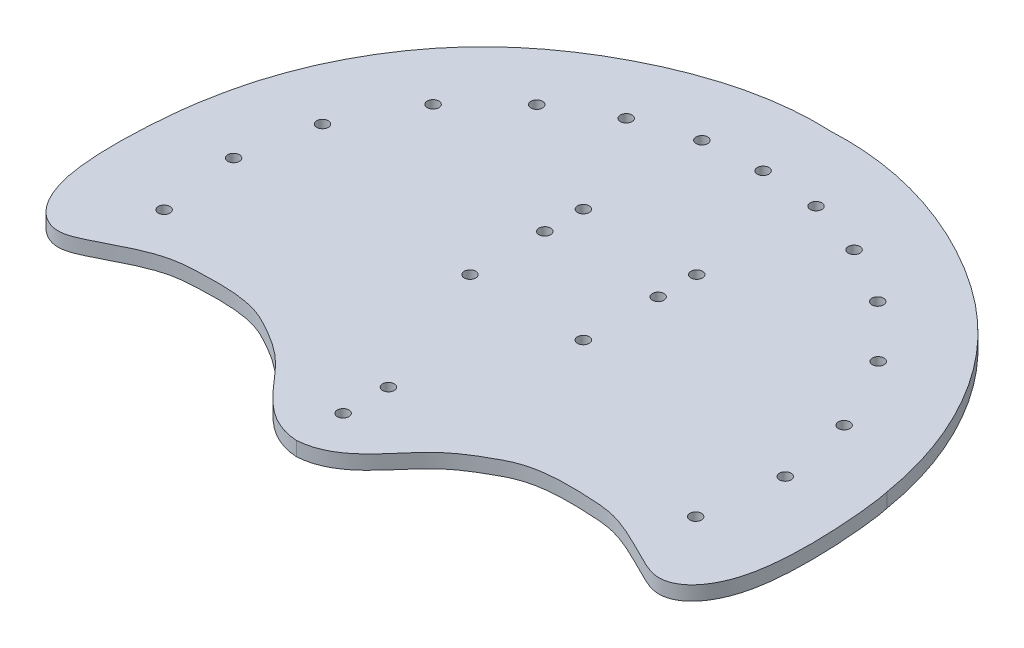
ISO-10303-21;
HEADER;
FILE_DESCRIPTION(('STEP AP214'),'2;1');
FILE_NAME('part.step','',(''),(''),'','','');
FILE_SCHEMA(('AUTOMOTIVE_DESIGN { 1 0 10303 214 1 1 1 1 }'));
ENDSEC;
DATA;
#1=APPLICATION_CONTEXT('core data for automotive mechanical design processes');
#2=APPLICATION_PROTOCOL_DEFINITION('international standard','automotive_design',2000,#1);
#3=PRODUCT_CONTEXT('',#1,'mechanical');
#4=PRODUCT('Part','Part','',(#3));
#5=PRODUCT_RELATED_PRODUCT_CATEGORY('part','',(#4));
#6=PRODUCT_DEFINITION_FORMATION('','',#4);
#7=PRODUCT_DEFINITION_CONTEXT('part definition',#1,'design');
#8=PRODUCT_DEFINITION('design','',#6,#7);
#9=PRODUCT_DEFINITION_SHAPE('','',#8);
#10=(LENGTH_UNIT() NAMED_UNIT(*) SI_UNIT(.MILLI.,.METRE.));
#11=(NAMED_UNIT(*) PLANE_ANGLE_UNIT() SI_UNIT($,.RADIAN.));
#12=(NAMED_UNIT(*) SI_UNIT($,.STERADIAN.) SOLID_ANGLE_UNIT());
#13=UNCERTAINTY_MEASURE_WITH_UNIT(LENGTH_MEASURE(1.E-05),#10,'distance_accuracy_value','');
#14=(GEOMETRIC_REPRESENTATION_CONTEXT(3) GLOBAL_UNCERTAINTY_ASSIGNED_CONTEXT((#13)) GLOBAL_UNIT_ASSIGNED_CONTEXT((#10,
#11,#12)) REPRESENTATION_CONTEXT('',''));
#15=CARTESIAN_POINT('',(0.,0.,0.));
#16=DIRECTION('',(0.,0.,1.));
#17=DIRECTION('',(1.,0.,0.));
#18=AXIS2_PLACEMENT_3D('',#15,#16,#17);
#19=CARTESIAN_POINT('',(-190.5,7.9502,0.));
#20=CARTESIAN_POINT('',(-192.064011792662,7.9502,4.96350192621509));
#21=CARTESIAN_POINT('',(-201.967167765924,7.9502,83.3146183109833));
#22=CARTESIAN_POINT('',(-174.696602041029,7.9502,109.289958804391));
#23=CARTESIAN_POINT('',(-151.630121659032,7.9502,100.567984898405));
#24=CARTESIAN_POINT('',(-131.410771519055,7.9502,87.7197839609674));
#25=CARTESIAN_POINT('',(-96.8435676275136,7.9502,85.3754033772216));
#26=CARTESIAN_POINT('',(-78.6925101438482,7.9502,86.2588274201763));
#27=CARTESIAN_POINT('',(-58.8335330715194,7.9502,96.8793824699203));
#28=CARTESIAN_POINT('',(-37.3059346099107,7.9502,109.935798161985));
#29=CARTESIAN_POINT('',(-21.3496139460233,7.9502,139.114767456721));
#30=CARTESIAN_POINT('',(1.40754784340045E-13,7.9502,140.530090072389));
#31=B_SPLINE_CURVE_WITH_KNOTS('',3,(#19,#20,#21,#22,#23,#24,#25,#26,#27,#28,#29,#30),
.UNSPECIFIED.,.F.,.F.,(4,1,1,1,1,1,1,1,1,4),(0.,0.166997051795611,0.292320514089622,
0.319633117373991,0.426735310498713,0.458914050276757,0.609241775376387,0.641909703937047,
0.766802370245909,1.),.UNSPECIFIED.);
#32=DIRECTION('',(0.,-1.,0.));
#33=VECTOR('',#32,1.);
#34=SURFACE_OF_LINEAR_EXTRUSION('',#31,#33);
#35=CARTESIAN_POINT('',(-190.5,0.,0.));
#36=CARTESIAN_POINT('',(-192.064011792662,0.,4.96350192621509));
#37=CARTESIAN_POINT('',(-201.967167765924,0.,83.3146183109833));
#38=CARTESIAN_POINT('',(-174.696602041029,0.,109.289958804391));
#39=CARTESIAN_POINT('',(-151.630121659032,0.,100.567984898405));
#40=CARTESIAN_POINT('',(-131.410771519055,0.,87.7197839609674));
#41=CARTESIAN_POINT('',(-96.8435676275136,0.,85.3754033772216));
#42=CARTESIAN_POINT('',(-78.6925101438482,0.,86.2588274201763));
#43=CARTESIAN_POINT('',(-58.8335330715194,0.,96.8793824699203));
#44=CARTESIAN_POINT('',(-37.3059346099107,0.,109.935798161985));
#45=CARTESIAN_POINT('',(-21.3496139460233,0.,139.114767456721));
#46=CARTESIAN_POINT('',(1.40754784340045E-13,0.,140.530090072389));
#47=B_SPLINE_CURVE_WITH_KNOTS('',3,(#35,#36,#37,#38,#39,#40,#41,#42,#43,#44,#45,#46),
.UNSPECIFIED.,.F.,.F.,(4,1,1,1,1,1,1,1,1,4),(0.,0.166997051795611,0.292320514089622,
0.319633117373991,0.426735310498713,0.458914050276757,0.609241775376387,0.641909703937047,
0.766802370245909,1.),.UNSPECIFIED.);
#48=CARTESIAN_POINT('',(-190.5,0.,0.));
#49=VERTEX_POINT('',#48);
#50=CARTESIAN_POINT('',(-1.06334839341837E-13,0.,140.530090072389));
#51=VERTEX_POINT('',#50);
#52=EDGE_CURVE('E132',#49,#51,#47,.T.);
#53=ORIENTED_EDGE('',*,*,#52,.T.);
#54=DIRECTION('',(0.,-1.,0.));
#55=VECTOR('',#54,1.);
#56=CARTESIAN_POINT('',(-1.06334839341837E-13,7.9502,140.530090072389));
#57=LINE('',#56,#55);
#58=CARTESIAN_POINT('',(-1.06334839341837E-13,7.9502,140.530090072389));
#59=VERTEX_POINT('',#58);
#60=EDGE_CURVE('E11',#59,#51,#57,.T.);
#61=ORIENTED_EDGE('',*,*,#60,.F.);
#62=CARTESIAN_POINT('',(-190.5,7.9502,0.));
#63=VERTEX_POINT('',#62);
#64=EDGE_CURVE('E95',#63,#59,#31,.T.);
#65=ORIENTED_EDGE('',*,*,#64,.F.);
#66=DIRECTION('',(0.,-1.,0.));
#67=VECTOR('',#66,1.);
#68=CARTESIAN_POINT('',(-190.5,7.9502,0.));
#69=LINE('',#68,#67);
#70=EDGE_CURVE('E103',#63,#49,#69,.T.);
#71=ORIENTED_EDGE('',*,*,#70,.T.);
#72=EDGE_LOOP('',(#53,#61,#65,#71));
#73=FACE_BOUND('',#72,.T.);
#74=ADVANCED_FACE('F43',(#73),#34,.F.);
#75=CARTESIAN_POINT('',(-1.06334839341837E-13,7.9502,140.530090072389));
#76=CARTESIAN_POINT('',(21.3496139460233,7.9502,139.114767456721));
#77=CARTESIAN_POINT('',(37.3059346099107,7.9502,109.935798161984));
#78=CARTESIAN_POINT('',(58.8335330715195,7.9502,96.8793824699203));
#79=CARTESIAN_POINT('',(78.6925101438482,7.9502,86.2588274201763));
#80=CARTESIAN_POINT('',(96.8435676275136,7.9502,85.3754033772216));
#81=CARTESIAN_POINT('',(131.410771519055,7.9502,87.7197839609674));
#82=CARTESIAN_POINT('',(151.630121659032,7.9502,100.567984898405));
#83=CARTESIAN_POINT('',(174.696602041029,7.9502,109.289958804391));
#84=CARTESIAN_POINT('',(201.967167765924,7.9502,83.3146183109832));
#85=CARTESIAN_POINT('',(192.064011792662,7.9502,4.96350192621503));
#86=CARTESIAN_POINT('',(190.5,7.9502,0.));
#87=B_SPLINE_CURVE_WITH_KNOTS('',3,(#75,#76,#77,#78,#79,#80,#81,#82,#83,#84,#85,#86),
.UNSPECIFIED.,.F.,.F.,(4,1,1,1,1,1,1,1,1,4),(0.,0.233197629754091,0.358090296062953,
0.390758224623613,0.541085949723243,0.573264689501287,0.680366882626009,0.707679485910378,
0.833002948204389,1.),.UNSPECIFIED.);
#88=DIRECTION('',(0.,-1.,0.));
#89=VECTOR('',#88,1.);
#90=SURFACE_OF_LINEAR_EXTRUSION('',#87,#89);
#91=CARTESIAN_POINT('',(-1.06334839341837E-13,0.,140.530090072389));
#92=CARTESIAN_POINT('',(21.3496139460233,0.,139.114767456721));
#93=CARTESIAN_POINT('',(37.3059346099107,0.,109.935798161984));
#94=CARTESIAN_POINT('',(58.8335330715195,0.,96.8793824699203));
#95=CARTESIAN_POINT('',(78.6925101438482,0.,86.2588274201763));
#96=CARTESIAN_POINT('',(96.8435676275136,0.,85.3754033772216));
#97=CARTESIAN_POINT('',(131.410771519055,0.,87.7197839609674));
#98=CARTESIAN_POINT('',(151.630121659032,0.,100.567984898405));
#99=CARTESIAN_POINT('',(174.696602041029,0.,109.289958804391));
#100=CARTESIAN_POINT('',(201.967167765924,0.,83.3146183109832));
#101=CARTESIAN_POINT('',(192.064011792662,0.,4.96350192621503));
#102=CARTESIAN_POINT('',(190.5,0.,0.));
#103=B_SPLINE_CURVE_WITH_KNOTS('',3,(#91,#92,#93,#94,#95,#96,#97,#98,#99,#100,#101,#102),
.UNSPECIFIED.,.F.,.F.,(4,1,1,1,1,1,1,1,1,4),(0.,0.233197629754091,0.358090296062953,
0.390758224623613,0.541085949723243,0.573264689501287,0.680366882626009,0.707679485910378,
0.833002948204389,1.),.UNSPECIFIED.);
#104=CARTESIAN_POINT('',(190.5,0.,0.));
#105=VERTEX_POINT('',#104);
#106=EDGE_CURVE('E99',#51,#105,#103,.T.);
#107=ORIENTED_EDGE('',*,*,#106,.T.);
#108=DIRECTION('',(0.,-1.,0.));
#109=VECTOR('',#108,1.);
#110=CARTESIAN_POINT('',(190.5,7.9502,0.));
#111=LINE('',#110,#109);
#112=CARTESIAN_POINT('',(190.5,7.9502,0.));
#113=VERTEX_POINT('',#112);
#114=EDGE_CURVE('E52',#113,#105,#111,.T.);
#115=ORIENTED_EDGE('',*,*,#114,.F.);
#116=EDGE_CURVE('E90',#59,#113,#87,.T.);
#117=ORIENTED_EDGE('',*,*,#116,.F.);
#118=ORIENTED_EDGE('',*,*,#60,.T.);
#119=EDGE_LOOP('',(#107,#115,#117,#118));
#120=FACE_BOUND('',#119,.T.);
#121=ADVANCED_FACE('F98',(#120),#90,.F.);
#122=CARTESIAN_POINT('',(190.5,7.9502,0.));
#123=CARTESIAN_POINT('',(184.392726562295,7.9502,-37.5370382365467));
#124=CARTESIAN_POINT('',(157.261289846749,7.9502,-93.9640934852783));
#125=CARTESIAN_POINT('',(82.3874782016624,7.9502,-146.622658841393));
#126=CARTESIAN_POINT('',(31.3113741429568,7.9502,-160.799884185231));
#127=CARTESIAN_POINT('',(0.,7.9502,-159.189909927611));
#128=B_SPLINE_CURVE_WITH_KNOTS('',3,(#122,#123,#124,#125,#126,#127),.UNSPECIFIED.,.F.,.F.,(4,1,
1,4),(0.,0.424401365551712,0.65636958095173,1.),.UNSPECIFIED.);
#129=DIRECTION('',(0.,-1.,0.));
#130=VECTOR('',#129,1.);
#131=SURFACE_OF_LINEAR_EXTRUSION('',#128,#130);
#132=CARTESIAN_POINT('',(190.5,0.,0.));
#133=CARTESIAN_POINT('',(184.392726562295,0.,-37.5370382365467));
#134=CARTESIAN_POINT('',(157.261289846749,0.,-93.9640934852783));
#135=CARTESIAN_POINT('',(82.3874782016624,0.,-146.622658841393));
#136=CARTESIAN_POINT('',(31.3113741429568,0.,-160.799884185231));
#137=CARTESIAN_POINT('',(0.,0.,-159.189909927611));
#138=B_SPLINE_CURVE_WITH_KNOTS('',3,(#132,#133,#134,#135,#136,#137),.UNSPECIFIED.,.F.,.F.,(4,1,
1,4),(0.,0.424401365551712,0.65636958095173,1.),.UNSPECIFIED.);
#139=CARTESIAN_POINT('',(0.,0.,-159.189909927611));
#140=VERTEX_POINT('',#139);
#141=EDGE_CURVE('E77',#105,#140,#138,.T.);
#142=ORIENTED_EDGE('',*,*,#141,.T.);
#143=DIRECTION('',(0.,-1.,0.));
#144=VECTOR('',#143,1.);
#145=CARTESIAN_POINT('',(0.,7.9502,-159.189909927611));
#146=LINE('',#145,#144);
#147=CARTESIAN_POINT('',(0.,7.9502,-159.189909927611));
#148=VERTEX_POINT('',#147);
#149=EDGE_CURVE('E100',#148,#140,#146,.T.);
#150=ORIENTED_EDGE('',*,*,#149,.F.);
#151=EDGE_CURVE('E93',#113,#148,#128,.T.);
#152=ORIENTED_EDGE('',*,*,#151,.F.);
#153=ORIENTED_EDGE('',*,*,#114,.T.);
#154=EDGE_LOOP('',(#142,#150,#152,#153));
#155=FACE_BOUND('',#154,.T.);
#156=ADVANCED_FACE('F101',(#155),#131,.F.);
#157=CARTESIAN_POINT('',(0.,7.9502,-159.189909927611));
#158=CARTESIAN_POINT('',(-31.3113741429568,7.9502,-160.799884185231));
#159=CARTESIAN_POINT('',(-82.3874782016624,7.9502,-146.622658841393));
#160=CARTESIAN_POINT('',(-157.261289846749,7.9502,-93.9640934852783));
#161=CARTESIAN_POINT('',(-184.392726562295,7.9502,-37.5370382365467));
#162=CARTESIAN_POINT('',(-190.5,7.9502,0.));
#163=B_SPLINE_CURVE_WITH_KNOTS('',3,(#157,#158,#159,#160,#161,#162),.UNSPECIFIED.,.F.,.F.,(4,1,
1,4),(0.,0.34363041904827,0.575598634448288,1.),.UNSPECIFIED.);
#164=DIRECTION('',(0.,-1.,0.));
#165=VECTOR('',#164,1.);
#166=SURFACE_OF_LINEAR_EXTRUSION('',#163,#165);
#167=CARTESIAN_POINT('',(0.,0.,-159.189909927611));
#168=CARTESIAN_POINT('',(-31.3113741429568,0.,-160.799884185231));
#169=CARTESIAN_POINT('',(-82.3874782016624,0.,-146.622658841393));
#170=CARTESIAN_POINT('',(-157.261289846749,0.,-93.9640934852783));
#171=CARTESIAN_POINT('',(-184.392726562295,0.,-37.5370382365467));
#172=CARTESIAN_POINT('',(-190.5,0.,0.));
#173=B_SPLINE_CURVE_WITH_KNOTS('',3,(#167,#168,#169,#170,#171,#172),.UNSPECIFIED.,.F.,.F.,(4,1,
1,4),(0.,0.34363041904827,0.575598634448288,1.),.UNSPECIFIED.);
#174=EDGE_CURVE('E83',#140,#49,#173,.T.);
#175=ORIENTED_EDGE('',*,*,#174,.T.);
#176=ORIENTED_EDGE('',*,*,#70,.F.);
#177=EDGE_CURVE('E60',#148,#63,#163,.T.);
#178=ORIENTED_EDGE('',*,*,#177,.F.);
#179=ORIENTED_EDGE('',*,*,#149,.T.);
#180=EDGE_LOOP('',(#175,#176,#178,#179));
#181=FACE_BOUND('',#180,.T.);
#182=ADVANCED_FACE('F121',(#181),#166,.F.);
#183=CARTESIAN_POINT('',(-98.1259130559372,7.9502,86.0527308590208));
#184=DIRECTION('',(0.,-1.,0.));
#185=DIRECTION('',(0.,0.,-1.));
#186=AXIS2_PLACEMENT_3D('',#183,#184,#185);
#187=PLANE('',#186);
#188=CARTESIAN_POINT('',(-31.75,7.9502,-52.07));
#189=DIRECTION('',(0.,-1.,0.));
#190=DIRECTION('',(0.,0.,-1.));
#191=AXIS2_PLACEMENT_3D('',#188,#189,#190);
#192=CIRCLE('',#191,3.2639);
#193=CARTESIAN_POINT('',(-31.75,7.9502,-55.3339));
#194=VERTEX_POINT('',#193);
#195=EDGE_CURVE('E270',#194,#194,#192,.T.);
#196=ORIENTED_EDGE('',*,*,#195,.T.);
#197=EDGE_LOOP('',(#196));
#198=FACE_BOUND('',#197,.T.);
#199=CARTESIAN_POINT('',(-31.75,7.9502,11.43));
#200=DIRECTION('',(0.,-1.,0.));
#201=DIRECTION('',(0.,0.,-1.));
#202=AXIS2_PLACEMENT_3D('',#199,#200,#201);
#203=CIRCLE('',#202,3.2639);
#204=CARTESIAN_POINT('',(-31.75,7.9502,8.16609999999999));
#205=VERTEX_POINT('',#204);
#206=EDGE_CURVE('E279',#205,#205,#203,.T.);
#207=ORIENTED_EDGE('',*,*,#206,.T.);
#208=EDGE_LOOP('',(#207));
#209=FACE_BOUND('',#208,.T.);
#210=CARTESIAN_POINT('',(31.75,7.9502,11.43));
#211=DIRECTION('',(0.,-1.,0.));
#212=DIRECTION('',(0.,0.,-1.));
#213=AXIS2_PLACEMENT_3D('',#210,#211,#212);
#214=CIRCLE('',#213,3.2639);
#215=CARTESIAN_POINT('',(31.75,7.9502,8.1661));
#216=VERTEX_POINT('',#215);
#217=EDGE_CURVE('E285',#216,#216,#214,.T.);
#218=ORIENTED_EDGE('',*,*,#217,.T.);
#219=EDGE_LOOP('',(#218));
#220=FACE_BOUND('',#219,.T.);
#221=CARTESIAN_POINT('',(-31.75,7.9502,-30.48));
#222=DIRECTION('',(0.,-1.,0.));
#223=DIRECTION('',(0.,0.,-1.));
#224=AXIS2_PLACEMENT_3D('',#221,#222,#223);
#225=CIRCLE('',#224,3.2639);
#226=CARTESIAN_POINT('',(-31.75,7.9502,-33.7439));
#227=VERTEX_POINT('',#226);
#228=EDGE_CURVE('E291',#227,#227,#225,.T.);
#229=ORIENTED_EDGE('',*,*,#228,.T.);
#230=EDGE_LOOP('',(#229));
#231=FACE_BOUND('',#230,.T.);
#232=CARTESIAN_POINT('',(31.75,7.9502,-30.48));
#233=DIRECTION('',(0.,-1.,0.));
#234=DIRECTION('',(0.,0.,-1.));
#235=AXIS2_PLACEMENT_3D('',#232,#233,#234);
#236=CIRCLE('',#235,3.2639);
#237=CARTESIAN_POINT('',(31.75,7.9502,-33.7439));
#238=VERTEX_POINT('',#237);
#239=EDGE_CURVE('E297',#238,#238,#236,.T.);
#240=ORIENTED_EDGE('',*,*,#239,.T.);
#241=EDGE_LOOP('',(#240));
#242=FACE_BOUND('',#241,.T.);
#243=CARTESIAN_POINT('',(31.75,7.9502,-52.07));
#244=DIRECTION('',(0.,-1.,0.));
#245=DIRECTION('',(0.,0.,-1.));
#246=AXIS2_PLACEMENT_3D('',#243,#244,#245);
#247=CIRCLE('',#246,3.2639);
#248=CARTESIAN_POINT('',(31.75,7.9502,-55.3339));
#249=VERTEX_POINT('',#248);
#250=EDGE_CURVE('E303',#249,#249,#247,.T.);
#251=ORIENTED_EDGE('',*,*,#250,.T.);
#252=EDGE_LOOP('',(#251));
#253=FACE_BOUND('',#252,.T.);
#254=CARTESIAN_POINT('',(154.550815557182,7.9502,21.0917662181185));
#255=DIRECTION('',(0.,-1.,0.));
#256=DIRECTION('',(0.,0.,-1.));
#257=AXIS2_PLACEMENT_3D('',#254,#255,#256);
#258=CIRCLE('',#257,3.26389999999999);
#259=CARTESIAN_POINT('',(154.550815557182,7.9502,17.8278662181185));
#260=VERTEX_POINT('',#259);
#261=EDGE_CURVE('E309',#260,#260,#258,.T.);
#262=ORIENTED_EDGE('',*,*,#261,.T.);
#263=EDGE_LOOP('',(#262));
#264=FACE_BOUND('',#263,.T.);
#265=CARTESIAN_POINT('',(148.921960359904,7.9502,65.6601339020379));
#266=DIRECTION('',(0.,-1.,0.));
#267=DIRECTION('',(0.,0.,-1.));
#268=AXIS2_PLACEMENT_3D('',#265,#266,#267);
#269=CIRCLE('',#268,3.26389999999999);
#270=CARTESIAN_POINT('',(148.921960359904,7.9502,62.3962339020379));
#271=VERTEX_POINT('',#270);
#272=EDGE_CURVE('E315',#271,#271,#269,.T.);
#273=ORIENTED_EDGE('',*,*,#272,.T.);
#274=EDGE_LOOP('',(#273));
#275=FACE_BOUND('',#274,.T.);
#276=CARTESIAN_POINT('',(146.146860676263,7.9502,-20.3200000020806));
#277=DIRECTION('',(0.,-1.,0.));
#278=DIRECTION('',(0.,0.,-1.));
#279=AXIS2_PLACEMENT_3D('',#276,#277,#278);
#280=CIRCLE('',#279,3.26389999999999);
#281=CARTESIAN_POINT('',(146.146860676263,7.9502,-23.5839000020806));
#282=VERTEX_POINT('',#281);
#283=EDGE_CURVE('E321',#282,#282,#280,.T.);
#284=ORIENTED_EDGE('',*,*,#283,.T.);
#285=EDGE_LOOP('',(#284));
#286=FACE_BOUND('',#285,.T.);
#287=CARTESIAN_POINT('',(124.716626151491,7.9502,-60.8428882843357));
#288=DIRECTION('',(0.,-1.,0.));
#289=DIRECTION('',(0.,0.,-1.));
#290=AXIS2_PLACEMENT_3D('',#287,#288,#289);
#291=CIRCLE('',#290,3.26389999999999);
#292=CARTESIAN_POINT('',(124.716626151491,7.9502,-64.1067882843356));
#293=VERTEX_POINT('',#292);
#294=EDGE_CURVE('E327',#293,#293,#291,.T.);
#295=ORIENTED_EDGE('',*,*,#294,.T.);
#296=EDGE_LOOP('',(#295));
#297=FACE_BOUND('',#296,.T.);
#298=CARTESIAN_POINT('',(-148.921960359904,7.9502,65.6601339020379));
#299=DIRECTION('',(0.,-1.,0.));
#300=DIRECTION('',(0.,0.,-1.));
#301=AXIS2_PLACEMENT_3D('',#298,#299,#300);
#302=CIRCLE('',#301,3.26389999999999);
#303=CARTESIAN_POINT('',(-148.921960359904,7.9502,62.3962339020379));
#304=VERTEX_POINT('',#303);
#305=EDGE_CURVE('E333',#304,#304,#302,.T.);
#306=ORIENTED_EDGE('',*,*,#305,.T.);
#307=EDGE_LOOP('',(#306));
#308=FACE_BOUND('',#307,.T.);
#309=CARTESIAN_POINT('',(-154.550815557182,7.9502,21.0917662181186));
#310=DIRECTION('',(0.,-1.,0.));
#311=DIRECTION('',(0.,0.,-1.));
#312=AXIS2_PLACEMENT_3D('',#309,#310,#311);
#313=CIRCLE('',#312,3.26389999999999);
#314=CARTESIAN_POINT('',(-154.550815557182,7.9502,17.8278662181186));
#315=VERTEX_POINT('',#314);
#316=EDGE_CURVE('E339',#315,#315,#313,.T.);
#317=ORIENTED_EDGE('',*,*,#316,.T.);
#318=EDGE_LOOP('',(#317));
#319=FACE_BOUND('',#318,.T.);
#320=CARTESIAN_POINT('',(-124.716626151491,7.9502,-60.8428882843356));
#321=DIRECTION('',(0.,-1.,0.));
#322=DIRECTION('',(0.,0.,-1.));
#323=AXIS2_PLACEMENT_3D('',#320,#321,#322);
#324=CIRCLE('',#323,3.2639);
#325=CARTESIAN_POINT('',(-124.716626151491,7.9502,-64.1067882843356));
#326=VERTEX_POINT('',#325);
#327=EDGE_CURVE('E345',#326,#326,#324,.T.);
#328=ORIENTED_EDGE('',*,*,#327,.T.);
#329=EDGE_LOOP('',(#328));
#330=FACE_BOUND('',#329,.T.);
#331=CARTESIAN_POINT('',(-95.5391970588063,7.9502,-89.7332897547069));
#332=DIRECTION('',(0.,-1.,0.));
#333=DIRECTION('',(0.,0.,-1.));
#334=AXIS2_PLACEMENT_3D('',#331,#332,#333);
#335=CIRCLE('',#334,3.2639);
#336=CARTESIAN_POINT('',(-95.5391970588063,7.9502,-92.9971897547069));
#337=VERTEX_POINT('',#336);
#338=EDGE_CURVE('E351',#337,#337,#335,.T.);
#339=ORIENTED_EDGE('',*,*,#338,.T.);
#340=EDGE_LOOP('',(#339));
#341=FACE_BOUND('',#340,.T.);
#342=CARTESIAN_POINT('',(-63.8443264066921,7.9502,-108.194176590831));
#343=DIRECTION('',(0.,-1.,0.));
#344=DIRECTION('',(0.,0.,-1.));
#345=AXIS2_PLACEMENT_3D('',#342,#343,#344);
#346=CIRCLE('',#345,3.2639);
#347=CARTESIAN_POINT('',(-63.8443264066921,7.9502,-111.458076590831));
#348=VERTEX_POINT('',#347);
#349=EDGE_CURVE('E357',#348,#348,#346,.T.);
#350=ORIENTED_EDGE('',*,*,#349,.T.);
#351=EDGE_LOOP('',(#350));
#352=FACE_BOUND('',#351,.T.);
#353=CARTESIAN_POINT('',(-31.9752570826837,7.9502,-118.729722320322));
#354=DIRECTION('',(0.,-1.,0.));
#355=DIRECTION('',(0.,0.,-1.));
#356=AXIS2_PLACEMENT_3D('',#353,#354,#355);
#357=CIRCLE('',#356,3.2639);
#358=CARTESIAN_POINT('',(-31.9752570826837,7.9502,-121.993622320322));
#359=VERTEX_POINT('',#358);
#360=EDGE_CURVE('E363',#359,#359,#357,.T.);
#361=ORIENTED_EDGE('',*,*,#360,.T.);
#362=EDGE_LOOP('',(#361));
#363=FACE_BOUND('',#362,.T.);
#364=CARTESIAN_POINT('',(0.,7.9502,-121.039578201729));
#365=DIRECTION('',(0.,-1.,0.));
#366=DIRECTION('',(0.,0.,-1.));
#367=AXIS2_PLACEMENT_3D('',#364,#365,#366);
#368=CIRCLE('',#367,3.2639);
#369=CARTESIAN_POINT('',(0.,7.9502,-124.303478201729));
#370=VERTEX_POINT('',#369);
#371=EDGE_CURVE('E369',#370,#370,#368,.T.);
#372=ORIENTED_EDGE('',*,*,#371,.T.);
#373=EDGE_LOOP('',(#372));
#374=FACE_BOUND('',#373,.T.);
#375=CARTESIAN_POINT('',(31.9752570826837,7.9502,-118.729722320322));
#376=DIRECTION('',(0.,-1.,0.));
#377=DIRECTION('',(0.,0.,-1.));
#378=AXIS2_PLACEMENT_3D('',#375,#376,#377);
#379=CIRCLE('',#378,3.2639);
#380=CARTESIAN_POINT('',(31.9752570826837,7.9502,-121.993622320322));
#381=VERTEX_POINT('',#380);
#382=EDGE_CURVE('E375',#381,#381,#379,.T.);
#383=ORIENTED_EDGE('',*,*,#382,.T.);
#384=EDGE_LOOP('',(#383));
#385=FACE_BOUND('',#384,.T.);
#386=CARTESIAN_POINT('',(63.8443264066921,7.9502,-108.194176590831));
#387=DIRECTION('',(0.,-1.,0.));
#388=DIRECTION('',(0.,0.,-1.));
#389=AXIS2_PLACEMENT_3D('',#386,#387,#388);
#390=CIRCLE('',#389,3.2639);
#391=CARTESIAN_POINT('',(63.8443264066921,7.9502,-111.458076590831));
#392=VERTEX_POINT('',#391);
#393=EDGE_CURVE('E381',#392,#392,#390,.T.);
#394=ORIENTED_EDGE('',*,*,#393,.T.);
#395=EDGE_LOOP('',(#394));
#396=FACE_BOUND('',#395,.T.);
#397=CARTESIAN_POINT('',(95.5391970588063,7.9502,-89.7332897547069));
#398=DIRECTION('',(0.,-1.,0.));
#399=DIRECTION('',(0.,0.,-1.));
#400=AXIS2_PLACEMENT_3D('',#397,#398,#399);
#401=CIRCLE('',#400,3.2639);
#402=CARTESIAN_POINT('',(95.5391970588063,7.9502,-92.9971897547069));
#403=VERTEX_POINT('',#402);
#404=EDGE_CURVE('E387',#403,#403,#401,.T.);
#405=ORIENTED_EDGE('',*,*,#404,.T.);
#406=EDGE_LOOP('',(#405));
#407=FACE_BOUND('',#406,.T.);
#408=CARTESIAN_POINT('',(-146.146860676254,7.9502,-20.32));
#409=DIRECTION('',(0.,-1.,0.));
#410=DIRECTION('',(0.,0.,-1.));
#411=AXIS2_PLACEMENT_3D('',#408,#409,#410);
#412=CIRCLE('',#411,3.26389999999999);
#413=CARTESIAN_POINT('',(-146.146860676254,7.9502,-23.5839));
#414=VERTEX_POINT('',#413);
#415=EDGE_CURVE('E393',#414,#414,#412,.T.);
#416=ORIENTED_EDGE('',*,*,#415,.T.);
#417=EDGE_LOOP('',(#416));
#418=FACE_BOUND('',#417,.T.);
#419=CARTESIAN_POINT('',(0.,7.9502,88.9));
#420=DIRECTION('',(0.,-1.,0.));
#421=DIRECTION('',(0.,0.,-1.));
#422=AXIS2_PLACEMENT_3D('',#419,#420,#421);
#423=CIRCLE('',#422,3.2639);
#424=CARTESIAN_POINT('',(0.,7.9502,85.6361));
#425=VERTEX_POINT('',#424);
#426=EDGE_CURVE('E399',#425,#425,#423,.T.);
#427=ORIENTED_EDGE('',*,*,#426,.T.);
#428=EDGE_LOOP('',(#427));
#429=FACE_BOUND('',#428,.T.);
#430=CARTESIAN_POINT('',(0.,7.9502,114.3));
#431=DIRECTION('',(0.,-1.,0.));
#432=DIRECTION('',(0.,0.,-1.));
#433=AXIS2_PLACEMENT_3D('',#430,#431,#432);
#434=CIRCLE('',#433,3.2639);
#435=CARTESIAN_POINT('',(0.,7.9502,111.0361));
#436=VERTEX_POINT('',#435);
#437=EDGE_CURVE('E134',#436,#436,#434,.T.);
#438=ORIENTED_EDGE('',*,*,#437,.T.);
#439=EDGE_LOOP('',(#438));
#440=FACE_BOUND('',#439,.T.);
#441=ORIENTED_EDGE('',*,*,#64,.T.);
#442=ORIENTED_EDGE('',*,*,#116,.T.);
#443=ORIENTED_EDGE('',*,*,#151,.T.);
#444=ORIENTED_EDGE('',*,*,#177,.T.);
#445=EDGE_LOOP('',(#441,#442,#443,#444));
#446=FACE_BOUND('',#445,.T.);
#447=ADVANCED_FACE('F91',(#198,#209,#220,#231,#242,#253,#264,#275,#286,#297,#308,#319,#330,#341,
#352,#363,#374,#385,#396,#407,#418,#429,#440,#446),#187,.F.);
#448=CARTESIAN_POINT('',(-98.1259130559372,0.,86.0527308590208));
#449=DIRECTION('',(0.,-1.,0.));
#450=DIRECTION('',(0.,0.,-1.));
#451=AXIS2_PLACEMENT_3D('',#448,#449,#450);
#452=PLANE('',#451);
#453=CARTESIAN_POINT('',(-31.75,0.,-52.07));
#454=DIRECTION('',(0.,-1.,0.));
#455=DIRECTION('',(0.,0.,-1.));
#456=AXIS2_PLACEMENT_3D('',#453,#454,#455);
#457=CIRCLE('',#456,3.2639);
#458=CARTESIAN_POINT('',(-31.75,0.,-55.3339));
#459=VERTEX_POINT('',#458);
#460=EDGE_CURVE('E272',#459,#459,#457,.T.);
#461=ORIENTED_EDGE('',*,*,#460,.F.);
#462=EDGE_LOOP('',(#461));
#463=FACE_BOUND('',#462,.T.);
#464=CARTESIAN_POINT('',(-31.75,0.,11.43));
#465=DIRECTION('',(0.,-1.,0.));
#466=DIRECTION('',(0.,0.,-1.));
#467=AXIS2_PLACEMENT_3D('',#464,#465,#466);
#468=CIRCLE('',#467,3.2639);
#469=CARTESIAN_POINT('',(-31.75,0.,8.16609999999999));
#470=VERTEX_POINT('',#469);
#471=EDGE_CURVE('E274',#470,#470,#468,.T.);
#472=ORIENTED_EDGE('',*,*,#471,.F.);
#473=EDGE_LOOP('',(#472));
#474=FACE_BOUND('',#473,.T.);
#475=CARTESIAN_POINT('',(31.75,0.,11.43));
#476=DIRECTION('',(0.,-1.,0.));
#477=DIRECTION('',(0.,0.,-1.));
#478=AXIS2_PLACEMENT_3D('',#475,#476,#477);
#479=CIRCLE('',#478,3.2639);
#480=CARTESIAN_POINT('',(31.75,0.,8.1661));
#481=VERTEX_POINT('',#480);
#482=EDGE_CURVE('E282',#481,#481,#479,.T.);
#483=ORIENTED_EDGE('',*,*,#482,.F.);
#484=EDGE_LOOP('',(#483));
#485=FACE_BOUND('',#484,.T.);
#486=CARTESIAN_POINT('',(-31.75,0.,-30.48));
#487=DIRECTION('',(0.,-1.,0.));
#488=DIRECTION('',(0.,0.,-1.));
#489=AXIS2_PLACEMENT_3D('',#486,#487,#488);
#490=CIRCLE('',#489,3.2639);
#491=CARTESIAN_POINT('',(-31.75,0.,-33.7439));
#492=VERTEX_POINT('',#491);
#493=EDGE_CURVE('E288',#492,#492,#490,.T.);
#494=ORIENTED_EDGE('',*,*,#493,.F.);
#495=EDGE_LOOP('',(#494));
#496=FACE_BOUND('',#495,.T.);
#497=CARTESIAN_POINT('',(31.75,0.,-30.48));
#498=DIRECTION('',(0.,-1.,0.));
#499=DIRECTION('',(0.,0.,-1.));
#500=AXIS2_PLACEMENT_3D('',#497,#498,#499);
#501=CIRCLE('',#500,3.2639);
#502=CARTESIAN_POINT('',(31.75,0.,-33.7439));
#503=VERTEX_POINT('',#502);
#504=EDGE_CURVE('E294',#503,#503,#501,.T.);
#505=ORIENTED_EDGE('',*,*,#504,.F.);
#506=EDGE_LOOP('',(#505));
#507=FACE_BOUND('',#506,.T.);
#508=CARTESIAN_POINT('',(31.75,0.,-52.07));
#509=DIRECTION('',(0.,-1.,0.));
#510=DIRECTION('',(0.,0.,-1.));
#511=AXIS2_PLACEMENT_3D('',#508,#509,#510);
#512=CIRCLE('',#511,3.2639);
#513=CARTESIAN_POINT('',(31.75,0.,-55.3339));
#514=VERTEX_POINT('',#513);
#515=EDGE_CURVE('E300',#514,#514,#512,.T.);
#516=ORIENTED_EDGE('',*,*,#515,.F.);
#517=EDGE_LOOP('',(#516));
#518=FACE_BOUND('',#517,.T.);
#519=CARTESIAN_POINT('',(154.550815557182,0.,21.0917662181185));
#520=DIRECTION('',(0.,-1.,0.));
#521=DIRECTION('',(0.,0.,-1.));
#522=AXIS2_PLACEMENT_3D('',#519,#520,#521);
#523=CIRCLE('',#522,3.26389999999999);
#524=CARTESIAN_POINT('',(154.550815557182,0.,17.8278662181185));
#525=VERTEX_POINT('',#524);
#526=EDGE_CURVE('E306',#525,#525,#523,.T.);
#527=ORIENTED_EDGE('',*,*,#526,.F.);
#528=EDGE_LOOP('',(#527));
#529=FACE_BOUND('',#528,.T.);
#530=CARTESIAN_POINT('',(148.921960359904,0.,65.6601339020379));
#531=DIRECTION('',(0.,-1.,0.));
#532=DIRECTION('',(0.,0.,-1.));
#533=AXIS2_PLACEMENT_3D('',#530,#531,#532);
#534=CIRCLE('',#533,3.26389999999999);
#535=CARTESIAN_POINT('',(148.921960359904,0.,62.3962339020379));
#536=VERTEX_POINT('',#535);
#537=EDGE_CURVE('E312',#536,#536,#534,.T.);
#538=ORIENTED_EDGE('',*,*,#537,.F.);
#539=EDGE_LOOP('',(#538));
#540=FACE_BOUND('',#539,.T.);
#541=CARTESIAN_POINT('',(146.146860676263,0.,-20.3200000020806));
#542=DIRECTION('',(0.,-1.,0.));
#543=DIRECTION('',(0.,0.,-1.));
#544=AXIS2_PLACEMENT_3D('',#541,#542,#543);
#545=CIRCLE('',#544,3.26389999999999);
#546=CARTESIAN_POINT('',(146.146860676263,0.,-23.5839000020806));
#547=VERTEX_POINT('',#546);
#548=EDGE_CURVE('E318',#547,#547,#545,.T.);
#549=ORIENTED_EDGE('',*,*,#548,.F.);
#550=EDGE_LOOP('',(#549));
#551=FACE_BOUND('',#550,.T.);
#552=CARTESIAN_POINT('',(124.716626151491,0.,-60.8428882843357));
#553=DIRECTION('',(0.,-1.,0.));
#554=DIRECTION('',(0.,0.,-1.));
#555=AXIS2_PLACEMENT_3D('',#552,#553,#554);
#556=CIRCLE('',#555,3.26389999999999);
#557=CARTESIAN_POINT('',(124.716626151491,0.,-64.1067882843356));
#558=VERTEX_POINT('',#557);
#559=EDGE_CURVE('E324',#558,#558,#556,.T.);
#560=ORIENTED_EDGE('',*,*,#559,.F.);
#561=EDGE_LOOP('',(#560));
#562=FACE_BOUND('',#561,.T.);
#563=CARTESIAN_POINT('',(-148.921960359904,0.,65.6601339020379));
#564=DIRECTION('',(0.,-1.,0.));
#565=DIRECTION('',(0.,0.,-1.));
#566=AXIS2_PLACEMENT_3D('',#563,#564,#565);
#567=CIRCLE('',#566,3.26389999999999);
#568=CARTESIAN_POINT('',(-148.921960359904,0.,62.3962339020379));
#569=VERTEX_POINT('',#568);
#570=EDGE_CURVE('E330',#569,#569,#567,.T.);
#571=ORIENTED_EDGE('',*,*,#570,.F.);
#572=EDGE_LOOP('',(#571));
#573=FACE_BOUND('',#572,.T.);
#574=CARTESIAN_POINT('',(-154.550815557182,0.,21.0917662181186));
#575=DIRECTION('',(0.,-1.,0.));
#576=DIRECTION('',(0.,0.,-1.));
#577=AXIS2_PLACEMENT_3D('',#574,#575,#576);
#578=CIRCLE('',#577,3.26389999999999);
#579=CARTESIAN_POINT('',(-154.550815557182,0.,17.8278662181186));
#580=VERTEX_POINT('',#579);
#581=EDGE_CURVE('E336',#580,#580,#578,.T.);
#582=ORIENTED_EDGE('',*,*,#581,.F.);
#583=EDGE_LOOP('',(#582));
#584=FACE_BOUND('',#583,.T.);
#585=CARTESIAN_POINT('',(-124.716626151491,0.,-60.8428882843356));
#586=DIRECTION('',(0.,-1.,0.));
#587=DIRECTION('',(0.,0.,-1.));
#588=AXIS2_PLACEMENT_3D('',#585,#586,#587);
#589=CIRCLE('',#588,3.2639);
#590=CARTESIAN_POINT('',(-124.716626151491,0.,-64.1067882843356));
#591=VERTEX_POINT('',#590);
#592=EDGE_CURVE('E342',#591,#591,#589,.T.);
#593=ORIENTED_EDGE('',*,*,#592,.F.);
#594=EDGE_LOOP('',(#593));
#595=FACE_BOUND('',#594,.T.);
#596=CARTESIAN_POINT('',(-95.5391970588063,0.,-89.7332897547069));
#597=DIRECTION('',(0.,-1.,0.));
#598=DIRECTION('',(0.,0.,-1.));
#599=AXIS2_PLACEMENT_3D('',#596,#597,#598);
#600=CIRCLE('',#599,3.2639);
#601=CARTESIAN_POINT('',(-95.5391970588063,0.,-92.9971897547069));
#602=VERTEX_POINT('',#601);
#603=EDGE_CURVE('E348',#602,#602,#600,.T.);
#604=ORIENTED_EDGE('',*,*,#603,.F.);
#605=EDGE_LOOP('',(#604));
#606=FACE_BOUND('',#605,.T.);
#607=CARTESIAN_POINT('',(-63.8443264066921,0.,-108.194176590831));
#608=DIRECTION('',(0.,-1.,0.));
#609=DIRECTION('',(0.,0.,-1.));
#610=AXIS2_PLACEMENT_3D('',#607,#608,#609);
#611=CIRCLE('',#610,3.2639);
#612=CARTESIAN_POINT('',(-63.8443264066921,0.,-111.458076590831));
#613=VERTEX_POINT('',#612);
#614=EDGE_CURVE('E354',#613,#613,#611,.T.);
#615=ORIENTED_EDGE('',*,*,#614,.F.);
#616=EDGE_LOOP('',(#615));
#617=FACE_BOUND('',#616,.T.);
#618=CARTESIAN_POINT('',(-31.9752570826837,0.,-118.729722320322));
#619=DIRECTION('',(0.,-1.,0.));
#620=DIRECTION('',(0.,0.,-1.));
#621=AXIS2_PLACEMENT_3D('',#618,#619,#620);
#622=CIRCLE('',#621,3.2639);
#623=CARTESIAN_POINT('',(-31.9752570826837,0.,-121.993622320322));
#624=VERTEX_POINT('',#623);
#625=EDGE_CURVE('E360',#624,#624,#622,.T.);
#626=ORIENTED_EDGE('',*,*,#625,.F.);
#627=EDGE_LOOP('',(#626));
#628=FACE_BOUND('',#627,.T.);
#629=CARTESIAN_POINT('',(0.,0.,-121.039578201729));
#630=DIRECTION('',(0.,-1.,0.));
#631=DIRECTION('',(0.,0.,-1.));
#632=AXIS2_PLACEMENT_3D('',#629,#630,#631);
#633=CIRCLE('',#632,3.2639);
#634=CARTESIAN_POINT('',(0.,0.,-124.303478201729));
#635=VERTEX_POINT('',#634);
#636=EDGE_CURVE('E366',#635,#635,#633,.T.);
#637=ORIENTED_EDGE('',*,*,#636,.F.);
#638=EDGE_LOOP('',(#637));
#639=FACE_BOUND('',#638,.T.);
#640=CARTESIAN_POINT('',(31.9752570826837,0.,-118.729722320322));
#641=DIRECTION('',(0.,-1.,0.));
#642=DIRECTION('',(0.,0.,-1.));
#643=AXIS2_PLACEMENT_3D('',#640,#641,#642);
#644=CIRCLE('',#643,3.2639);
#645=CARTESIAN_POINT('',(31.9752570826837,0.,-121.993622320322));
#646=VERTEX_POINT('',#645);
#647=EDGE_CURVE('E372',#646,#646,#644,.T.);
#648=ORIENTED_EDGE('',*,*,#647,.F.);
#649=EDGE_LOOP('',(#648));
#650=FACE_BOUND('',#649,.T.);
#651=CARTESIAN_POINT('',(63.8443264066921,0.,-108.194176590831));
#652=DIRECTION('',(0.,-1.,0.));
#653=DIRECTION('',(0.,0.,-1.));
#654=AXIS2_PLACEMENT_3D('',#651,#652,#653);
#655=CIRCLE('',#654,3.2639);
#656=CARTESIAN_POINT('',(63.8443264066921,0.,-111.458076590831));
#657=VERTEX_POINT('',#656);
#658=EDGE_CURVE('E378',#657,#657,#655,.T.);
#659=ORIENTED_EDGE('',*,*,#658,.F.);
#660=EDGE_LOOP('',(#659));
#661=FACE_BOUND('',#660,.T.);
#662=CARTESIAN_POINT('',(95.5391970588063,0.,-89.7332897547069));
#663=DIRECTION('',(0.,-1.,0.));
#664=DIRECTION('',(0.,0.,-1.));
#665=AXIS2_PLACEMENT_3D('',#662,#663,#664);
#666=CIRCLE('',#665,3.2639);
#667=CARTESIAN_POINT('',(95.5391970588063,0.,-92.9971897547069));
#668=VERTEX_POINT('',#667);
#669=EDGE_CURVE('E384',#668,#668,#666,.T.);
#670=ORIENTED_EDGE('',*,*,#669,.F.);
#671=EDGE_LOOP('',(#670));
#672=FACE_BOUND('',#671,.T.);
#673=CARTESIAN_POINT('',(-146.146860676254,0.,-20.32));
#674=DIRECTION('',(0.,-1.,0.));
#675=DIRECTION('',(0.,0.,-1.));
#676=AXIS2_PLACEMENT_3D('',#673,#674,#675);
#677=CIRCLE('',#676,3.26389999999999);
#678=CARTESIAN_POINT('',(-146.146860676254,0.,-23.5839));
#679=VERTEX_POINT('',#678);
#680=EDGE_CURVE('E390',#679,#679,#677,.T.);
#681=ORIENTED_EDGE('',*,*,#680,.F.);
#682=EDGE_LOOP('',(#681));
#683=FACE_BOUND('',#682,.T.);
#684=CARTESIAN_POINT('',(0.,0.,88.9));
#685=DIRECTION('',(0.,-1.,0.));
#686=DIRECTION('',(0.,0.,-1.));
#687=AXIS2_PLACEMENT_3D('',#684,#685,#686);
#688=CIRCLE('',#687,3.2639);
#689=CARTESIAN_POINT('',(0.,0.,85.6361));
#690=VERTEX_POINT('',#689);
#691=EDGE_CURVE('E396',#690,#690,#688,.T.);
#692=ORIENTED_EDGE('',*,*,#691,.F.);
#693=EDGE_LOOP('',(#692));
#694=FACE_BOUND('',#693,.T.);
#695=CARTESIAN_POINT('',(0.,0.,114.3));
#696=DIRECTION('',(0.,-1.,0.));
#697=DIRECTION('',(0.,0.,-1.));
#698=AXIS2_PLACEMENT_3D('',#695,#696,#697);
#699=CIRCLE('',#698,3.2639);
#700=CARTESIAN_POINT('',(0.,0.,111.0361));
#701=VERTEX_POINT('',#700);
#702=EDGE_CURVE('E137',#701,#701,#699,.T.);
#703=ORIENTED_EDGE('',*,*,#702,.F.);
#704=EDGE_LOOP('',(#703));
#705=FACE_BOUND('',#704,.T.);
#706=ORIENTED_EDGE('',*,*,#52,.F.);
#707=ORIENTED_EDGE('',*,*,#174,.F.);
#708=ORIENTED_EDGE('',*,*,#141,.F.);
#709=ORIENTED_EDGE('',*,*,#106,.F.);
#710=EDGE_LOOP('',(#706,#707,#708,#709));
#711=FACE_BOUND('',#710,.T.);
#712=ADVANCED_FACE('F163',(#463,#474,#485,#496,#507,#518,#529,#540,#551,#562,#573,#584,#595,
#606,#617,#628,#639,#650,#661,#672,#683,#694,#705,#711),#452,.T.);
#713=CARTESIAN_POINT('',(0.,0.,114.3));
#714=DIRECTION('',(0.,-1.,0.));
#715=DIRECTION('',(0.,0.,-1.));
#716=AXIS2_PLACEMENT_3D('',#713,#714,#715);
#717=CYLINDRICAL_SURFACE('',#716,3.2639);
#718=ORIENTED_EDGE('',*,*,#437,.F.);
#719=EDGE_LOOP('',(#718));
#720=FACE_BOUND('',#719,.T.);
#721=ORIENTED_EDGE('',*,*,#702,.T.);
#722=EDGE_LOOP('',(#721));
#723=FACE_BOUND('',#722,.T.);
#724=ADVANCED_FACE('F165',(#720,#723),#717,.F.);
#725=CARTESIAN_POINT('',(0.,0.,88.9));
#726=DIRECTION('',(0.,-1.,0.));
#727=DIRECTION('',(0.,0.,-1.));
#728=AXIS2_PLACEMENT_3D('',#725,#726,#727);
#729=CYLINDRICAL_SURFACE('',#728,3.2639);
#730=ORIENTED_EDGE('',*,*,#426,.F.);
#731=EDGE_LOOP('',(#730));
#732=FACE_BOUND('',#731,.T.);
#733=ORIENTED_EDGE('',*,*,#691,.T.);
#734=EDGE_LOOP('',(#733));
#735=FACE_BOUND('',#734,.T.);
#736=ADVANCED_FACE('F171',(#732,#735),#729,.F.);
#737=CARTESIAN_POINT('',(-146.146860676254,0.,-20.32));
#738=DIRECTION('',(0.,-1.,0.));
#739=DIRECTION('',(0.,0.,-1.));
#740=AXIS2_PLACEMENT_3D('',#737,#738,#739);
#741=CYLINDRICAL_SURFACE('',#740,3.26389999999999);
#742=ORIENTED_EDGE('',*,*,#415,.F.);
#743=EDGE_LOOP('',(#742));
#744=FACE_BOUND('',#743,.T.);
#745=ORIENTED_EDGE('',*,*,#680,.T.);
#746=EDGE_LOOP('',(#745));
#747=FACE_BOUND('',#746,.T.);
#748=ADVANCED_FACE('F181',(#744,#747),#741,.F.);
#749=CARTESIAN_POINT('',(95.5391970588063,0.,-89.7332897547069));
#750=DIRECTION('',(0.,-1.,0.));
#751=DIRECTION('',(0.,0.,-1.));
#752=AXIS2_PLACEMENT_3D('',#749,#750,#751);
#753=CYLINDRICAL_SURFACE('',#752,3.2639);
#754=ORIENTED_EDGE('',*,*,#404,.F.);
#755=EDGE_LOOP('',(#754));
#756=FACE_BOUND('',#755,.T.);
#757=ORIENTED_EDGE('',*,*,#669,.T.);
#758=EDGE_LOOP('',(#757));
#759=FACE_BOUND('',#758,.T.);
#760=ADVANCED_FACE('F185',(#756,#759),#753,.F.);
#761=CARTESIAN_POINT('',(63.8443264066921,0.,-108.194176590831));
#762=DIRECTION('',(0.,-1.,0.));
#763=DIRECTION('',(0.,0.,-1.));
#764=AXIS2_PLACEMENT_3D('',#761,#762,#763);
#765=CYLINDRICAL_SURFACE('',#764,3.2639);
#766=ORIENTED_EDGE('',*,*,#393,.F.);
#767=EDGE_LOOP('',(#766));
#768=FACE_BOUND('',#767,.T.);
#769=ORIENTED_EDGE('',*,*,#658,.T.);
#770=EDGE_LOOP('',(#769));
#771=FACE_BOUND('',#770,.T.);
#772=ADVANCED_FACE('F189',(#768,#771),#765,.F.);
#773=CARTESIAN_POINT('',(31.9752570826837,0.,-118.729722320322));
#774=DIRECTION('',(0.,-1.,0.));
#775=DIRECTION('',(0.,0.,-1.));
#776=AXIS2_PLACEMENT_3D('',#773,#774,#775);
#777=CYLINDRICAL_SURFACE('',#776,3.2639);
#778=ORIENTED_EDGE('',*,*,#382,.F.);
#779=EDGE_LOOP('',(#778));
#780=FACE_BOUND('',#779,.T.);
#781=ORIENTED_EDGE('',*,*,#647,.T.);
#782=EDGE_LOOP('',(#781));
#783=FACE_BOUND('',#782,.T.);
#784=ADVANCED_FACE('F193',(#780,#783),#777,.F.);
#785=CARTESIAN_POINT('',(0.,0.,-121.039578201729));
#786=DIRECTION('',(0.,-1.,0.));
#787=DIRECTION('',(0.,0.,-1.));
#788=AXIS2_PLACEMENT_3D('',#785,#786,#787);
#789=CYLINDRICAL_SURFACE('',#788,3.2639);
#790=ORIENTED_EDGE('',*,*,#371,.F.);
#791=EDGE_LOOP('',(#790));
#792=FACE_BOUND('',#791,.T.);
#793=ORIENTED_EDGE('',*,*,#636,.T.);
#794=EDGE_LOOP('',(#793));
#795=FACE_BOUND('',#794,.T.);
#796=ADVANCED_FACE('F197',(#792,#795),#789,.F.);
#797=CARTESIAN_POINT('',(-31.9752570826837,0.,-118.729722320322));
#798=DIRECTION('',(0.,-1.,0.));
#799=DIRECTION('',(0.,0.,-1.));
#800=AXIS2_PLACEMENT_3D('',#797,#798,#799);
#801=CYLINDRICAL_SURFACE('',#800,3.2639);
#802=ORIENTED_EDGE('',*,*,#360,.F.);
#803=EDGE_LOOP('',(#802));
#804=FACE_BOUND('',#803,.T.);
#805=ORIENTED_EDGE('',*,*,#625,.T.);
#806=EDGE_LOOP('',(#805));
#807=FACE_BOUND('',#806,.T.);
#808=ADVANCED_FACE('F201',(#804,#807),#801,.F.);
#809=CARTESIAN_POINT('',(-63.8443264066921,0.,-108.194176590831));
#810=DIRECTION('',(0.,-1.,0.));
#811=DIRECTION('',(0.,0.,-1.));
#812=AXIS2_PLACEMENT_3D('',#809,#810,#811);
#813=CYLINDRICAL_SURFACE('',#812,3.2639);
#814=ORIENTED_EDGE('',*,*,#349,.F.);
#815=EDGE_LOOP('',(#814));
#816=FACE_BOUND('',#815,.T.);
#817=ORIENTED_EDGE('',*,*,#614,.T.);
#818=EDGE_LOOP('',(#817));
#819=FACE_BOUND('',#818,.T.);
#820=ADVANCED_FACE('F205',(#816,#819),#813,.F.);
#821=CARTESIAN_POINT('',(-95.5391970588063,0.,-89.7332897547069));
#822=DIRECTION('',(0.,-1.,0.));
#823=DIRECTION('',(0.,0.,-1.));
#824=AXIS2_PLACEMENT_3D('',#821,#822,#823);
#825=CYLINDRICAL_SURFACE('',#824,3.2639);
#826=ORIENTED_EDGE('',*,*,#338,.F.);
#827=EDGE_LOOP('',(#826));
#828=FACE_BOUND('',#827,.T.);
#829=ORIENTED_EDGE('',*,*,#603,.T.);
#830=EDGE_LOOP('',(#829));
#831=FACE_BOUND('',#830,.T.);
#832=ADVANCED_FACE('F209',(#828,#831),#825,.F.);
#833=CARTESIAN_POINT('',(-124.716626151491,0.,-60.8428882843356));
#834=DIRECTION('',(0.,-1.,0.));
#835=DIRECTION('',(0.,0.,-1.));
#836=AXIS2_PLACEMENT_3D('',#833,#834,#835);
#837=CYLINDRICAL_SURFACE('',#836,3.2639);
#838=ORIENTED_EDGE('',*,*,#327,.F.);
#839=EDGE_LOOP('',(#838));
#840=FACE_BOUND('',#839,.T.);
#841=ORIENTED_EDGE('',*,*,#592,.T.);
#842=EDGE_LOOP('',(#841));
#843=FACE_BOUND('',#842,.T.);
#844=ADVANCED_FACE('F213',(#840,#843),#837,.F.);
#845=CARTESIAN_POINT('',(-154.550815557182,0.,21.0917662181186));
#846=DIRECTION('',(0.,-1.,0.));
#847=DIRECTION('',(0.,0.,-1.));
#848=AXIS2_PLACEMENT_3D('',#845,#846,#847);
#849=CYLINDRICAL_SURFACE('',#848,3.26389999999999);
#850=ORIENTED_EDGE('',*,*,#316,.F.);
#851=EDGE_LOOP('',(#850));
#852=FACE_BOUND('',#851,.T.);
#853=ORIENTED_EDGE('',*,*,#581,.T.);
#854=EDGE_LOOP('',(#853));
#855=FACE_BOUND('',#854,.T.);
#856=ADVANCED_FACE('F217',(#852,#855),#849,.F.);
#857=CARTESIAN_POINT('',(-148.921960359904,0.,65.6601339020379));
#858=DIRECTION('',(0.,-1.,0.));
#859=DIRECTION('',(0.,0.,-1.));
#860=AXIS2_PLACEMENT_3D('',#857,#858,#859);
#861=CYLINDRICAL_SURFACE('',#860,3.26389999999999);
#862=ORIENTED_EDGE('',*,*,#305,.F.);
#863=EDGE_LOOP('',(#862));
#864=FACE_BOUND('',#863,.T.);
#865=ORIENTED_EDGE('',*,*,#570,.T.);
#866=EDGE_LOOP('',(#865));
#867=FACE_BOUND('',#866,.T.);
#868=ADVANCED_FACE('F221',(#864,#867),#861,.F.);
#869=CARTESIAN_POINT('',(124.716626151491,0.,-60.8428882843357));
#870=DIRECTION('',(0.,-1.,0.));
#871=DIRECTION('',(0.,0.,-1.));
#872=AXIS2_PLACEMENT_3D('',#869,#870,#871);
#873=CYLINDRICAL_SURFACE('',#872,3.26389999999999);
#874=ORIENTED_EDGE('',*,*,#294,.F.);
#875=EDGE_LOOP('',(#874));
#876=FACE_BOUND('',#875,.T.);
#877=ORIENTED_EDGE('',*,*,#559,.T.);
#878=EDGE_LOOP('',(#877));
#879=FACE_BOUND('',#878,.T.);
#880=ADVANCED_FACE('F225',(#876,#879),#873,.F.);
#881=CARTESIAN_POINT('',(146.146860676263,0.,-20.3200000020806));
#882=DIRECTION('',(0.,-1.,0.));
#883=DIRECTION('',(0.,0.,-1.));
#884=AXIS2_PLACEMENT_3D('',#881,#882,#883);
#885=CYLINDRICAL_SURFACE('',#884,3.26389999999999);
#886=ORIENTED_EDGE('',*,*,#283,.F.);
#887=EDGE_LOOP('',(#886));
#888=FACE_BOUND('',#887,.T.);
#889=ORIENTED_EDGE('',*,*,#548,.T.);
#890=EDGE_LOOP('',(#889));
#891=FACE_BOUND('',#890,.T.);
#892=ADVANCED_FACE('F229',(#888,#891),#885,.F.);
#893=CARTESIAN_POINT('',(148.921960359904,0.,65.6601339020379));
#894=DIRECTION('',(0.,-1.,0.));
#895=DIRECTION('',(0.,0.,-1.));
#896=AXIS2_PLACEMENT_3D('',#893,#894,#895);
#897=CYLINDRICAL_SURFACE('',#896,3.26389999999999);
#898=ORIENTED_EDGE('',*,*,#272,.F.);
#899=EDGE_LOOP('',(#898));
#900=FACE_BOUND('',#899,.T.);
#901=ORIENTED_EDGE('',*,*,#537,.T.);
#902=EDGE_LOOP('',(#901));
#903=FACE_BOUND('',#902,.T.);
#904=ADVANCED_FACE('F233',(#900,#903),#897,.F.);
#905=CARTESIAN_POINT('',(154.550815557182,0.,21.0917662181185));
#906=DIRECTION('',(0.,-1.,0.));
#907=DIRECTION('',(0.,0.,-1.));
#908=AXIS2_PLACEMENT_3D('',#905,#906,#907);
#909=CYLINDRICAL_SURFACE('',#908,3.26389999999999);
#910=ORIENTED_EDGE('',*,*,#261,.F.);
#911=EDGE_LOOP('',(#910));
#912=FACE_BOUND('',#911,.T.);
#913=ORIENTED_EDGE('',*,*,#526,.T.);
#914=EDGE_LOOP('',(#913));
#915=FACE_BOUND('',#914,.T.);
#916=ADVANCED_FACE('F237',(#912,#915),#909,.F.);
#917=CARTESIAN_POINT('',(31.75,0.,-52.07));
#918=DIRECTION('',(0.,-1.,0.));
#919=DIRECTION('',(0.,0.,-1.));
#920=AXIS2_PLACEMENT_3D('',#917,#918,#919);
#921=CYLINDRICAL_SURFACE('',#920,3.2639);
#922=ORIENTED_EDGE('',*,*,#250,.F.);
#923=EDGE_LOOP('',(#922));
#924=FACE_BOUND('',#923,.T.);
#925=ORIENTED_EDGE('',*,*,#515,.T.);
#926=EDGE_LOOP('',(#925));
#927=FACE_BOUND('',#926,.T.);
#928=ADVANCED_FACE('F241',(#924,#927),#921,.F.);
#929=CARTESIAN_POINT('',(31.75,0.,-30.48));
#930=DIRECTION('',(0.,-1.,0.));
#931=DIRECTION('',(0.,0.,-1.));
#932=AXIS2_PLACEMENT_3D('',#929,#930,#931);
#933=CYLINDRICAL_SURFACE('',#932,3.2639);
#934=ORIENTED_EDGE('',*,*,#239,.F.);
#935=EDGE_LOOP('',(#934));
#936=FACE_BOUND('',#935,.T.);
#937=ORIENTED_EDGE('',*,*,#504,.T.);
#938=EDGE_LOOP('',(#937));
#939=FACE_BOUND('',#938,.T.);
#940=ADVANCED_FACE('F245',(#936,#939),#933,.F.);
#941=CARTESIAN_POINT('',(-31.75,0.,-30.48));
#942=DIRECTION('',(0.,-1.,0.));
#943=DIRECTION('',(0.,0.,-1.));
#944=AXIS2_PLACEMENT_3D('',#941,#942,#943);
#945=CYLINDRICAL_SURFACE('',#944,3.2639);
#946=ORIENTED_EDGE('',*,*,#228,.F.);
#947=EDGE_LOOP('',(#946));
#948=FACE_BOUND('',#947,.T.);
#949=ORIENTED_EDGE('',*,*,#493,.T.);
#950=EDGE_LOOP('',(#949));
#951=FACE_BOUND('',#950,.T.);
#952=ADVANCED_FACE('F249',(#948,#951),#945,.F.);
#953=CARTESIAN_POINT('',(31.75,0.,11.43));
#954=DIRECTION('',(0.,-1.,0.));
#955=DIRECTION('',(0.,0.,-1.));
#956=AXIS2_PLACEMENT_3D('',#953,#954,#955);
#957=CYLINDRICAL_SURFACE('',#956,3.2639);
#958=ORIENTED_EDGE('',*,*,#217,.F.);
#959=EDGE_LOOP('',(#958));
#960=FACE_BOUND('',#959,.T.);
#961=ORIENTED_EDGE('',*,*,#482,.T.);
#962=EDGE_LOOP('',(#961));
#963=FACE_BOUND('',#962,.T.);
#964=ADVANCED_FACE('F253',(#960,#963),#957,.F.);
#965=CARTESIAN_POINT('',(-31.75,0.,11.43));
#966=DIRECTION('',(0.,-1.,0.));
#967=DIRECTION('',(0.,0.,-1.));
#968=AXIS2_PLACEMENT_3D('',#965,#966,#967);
#969=CYLINDRICAL_SURFACE('',#968,3.2639);
#970=ORIENTED_EDGE('',*,*,#206,.F.);
#971=EDGE_LOOP('',(#970));
#972=FACE_BOUND('',#971,.T.);
#973=ORIENTED_EDGE('',*,*,#471,.T.);
#974=EDGE_LOOP('',(#973));
#975=FACE_BOUND('',#974,.T.);
#976=ADVANCED_FACE('F257',(#972,#975),#969,.F.);
#977=CARTESIAN_POINT('',(-31.75,0.,-52.07));
#978=DIRECTION('',(0.,-1.,0.));
#979=DIRECTION('',(0.,0.,-1.));
#980=AXIS2_PLACEMENT_3D('',#977,#978,#979);
#981=CYLINDRICAL_SURFACE('',#980,3.2639);
#982=ORIENTED_EDGE('',*,*,#195,.F.);
#983=EDGE_LOOP('',(#982));
#984=FACE_BOUND('',#983,.T.);
#985=ORIENTED_EDGE('',*,*,#460,.T.);
#986=EDGE_LOOP('',(#985));
#987=FACE_BOUND('',#986,.T.);
#988=ADVANCED_FACE('F261',(#984,#987),#981,.F.);
#989=CLOSED_SHELL('',(#74,#121,#156,#182,#447,#712,#724,#736,#748,#760,#772,#784,#796,#808,#820,
#832,#844,#856,#868,#880,#892,#904,#916,#928,#940,#952,#964,#976,#988));
#990=MANIFOLD_SOLID_BREP('B2',#989);
#991=ADVANCED_BREP_SHAPE_REPRESENTATION('',(#18,#990),#14);
#992=SHAPE_DEFINITION_REPRESENTATION(#9,#991);
ENDSEC;
END-ISO-10303-21;
